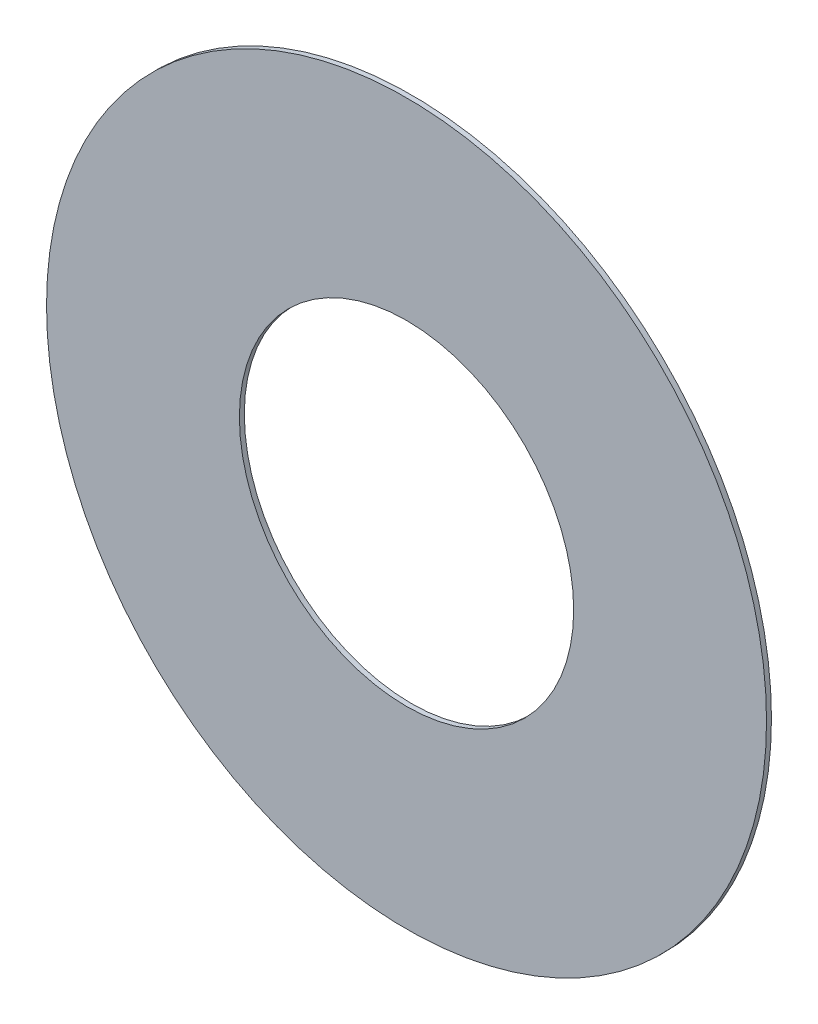
ISO-10303-21;
HEADER;
FILE_DESCRIPTION(('STEP AP214'),'2;1');
FILE_NAME('part.step','',(''),(''),'','','');
FILE_SCHEMA(('AUTOMOTIVE_DESIGN { 1 0 10303 214 1 1 1 1 }'));
ENDSEC;
DATA;
#1=APPLICATION_CONTEXT('core data for automotive mechanical design processes');
#2=APPLICATION_PROTOCOL_DEFINITION('international standard','automotive_design',2000,#1);
#3=PRODUCT_CONTEXT('',#1,'mechanical');
#4=PRODUCT('Part','Part','',(#3));
#5=PRODUCT_RELATED_PRODUCT_CATEGORY('part','',(#4));
#6=PRODUCT_DEFINITION_FORMATION('','',#4);
#7=PRODUCT_DEFINITION_CONTEXT('part definition',#1,'design');
#8=PRODUCT_DEFINITION('design','',#6,#7);
#9=PRODUCT_DEFINITION_SHAPE('','',#8);
#10=(LENGTH_UNIT() NAMED_UNIT(*) SI_UNIT(.MILLI.,.METRE.));
#11=(NAMED_UNIT(*) PLANE_ANGLE_UNIT() SI_UNIT($,.RADIAN.));
#12=(NAMED_UNIT(*) SI_UNIT($,.STERADIAN.) SOLID_ANGLE_UNIT());
#13=UNCERTAINTY_MEASURE_WITH_UNIT(LENGTH_MEASURE(1.E-05),#10,'distance_accuracy_value','');
#14=(GEOMETRIC_REPRESENTATION_CONTEXT(3) GLOBAL_UNCERTAINTY_ASSIGNED_CONTEXT((#13)) GLOBAL_UNIT_ASSIGNED_CONTEXT((#10,
#11,#12)) REPRESENTATION_CONTEXT('',''));
#15=CARTESIAN_POINT('',(0.,0.,0.));
#16=DIRECTION('',(0.,0.,1.));
#17=DIRECTION('',(1.,0.,0.));
#18=AXIS2_PLACEMENT_3D('',#15,#16,#17);
#19=CARTESIAN_POINT('',(0.,0.,0.0762));
#20=DIRECTION('',(0.,0.,-1.));
#21=DIRECTION('',(-1.,0.,0.));
#22=AXIS2_PLACEMENT_3D('',#19,#20,#21);
#23=CYLINDRICAL_SURFACE('',#22,5.55625);
#24=CARTESIAN_POINT('',(0.,0.,0.0762));
#25=DIRECTION('',(0.,0.,-1.));
#26=DIRECTION('',(1.,0.,0.));
#27=AXIS2_PLACEMENT_3D('',#24,#25,#26);
#28=CIRCLE('',#27,5.55625);
#29=CARTESIAN_POINT('',(5.55625,0.,0.0762));
#30=VERTEX_POINT('',#29);
#31=EDGE_CURVE('E10',#30,#30,#28,.T.);
#32=ORIENTED_EDGE('',*,*,#31,.T.);
#33=EDGE_LOOP('',(#32));
#34=FACE_BOUND('',#33,.T.);
#35=CARTESIAN_POINT('',(0.,0.,0.));
#36=DIRECTION('',(0.,0.,-1.));
#37=DIRECTION('',(1.,0.,0.));
#38=AXIS2_PLACEMENT_3D('',#35,#36,#37);
#39=CIRCLE('',#38,5.55625);
#40=CARTESIAN_POINT('',(5.55625,0.,0.));
#41=VERTEX_POINT('',#40);
#42=EDGE_CURVE('E33',#41,#41,#39,.T.);
#43=ORIENTED_EDGE('',*,*,#42,.F.);
#44=EDGE_LOOP('',(#43));
#45=FACE_BOUND('',#44,.T.);
#46=ADVANCED_FACE('F30',(#34,#45),#23,.T.);
#47=CARTESIAN_POINT('',(0.,0.,0.0762));
#48=DIRECTION('',(0.,0.,1.));
#49=DIRECTION('',(1.,0.,0.));
#50=AXIS2_PLACEMENT_3D('',#47,#48,#49);
#51=PLANE('',#50);
#52=CARTESIAN_POINT('',(0.,0.,0.0762));
#53=DIRECTION('',(0.,0.,-1.));
#54=DIRECTION('',(1.,0.,0.));
#55=AXIS2_PLACEMENT_3D('',#52,#53,#54);
#56=CIRCLE('',#55,2.5796875);
#57=CARTESIAN_POINT('',(2.5796875,0.,0.0762));
#58=VERTEX_POINT('',#57);
#59=EDGE_CURVE('E40',#58,#58,#56,.T.);
#60=ORIENTED_EDGE('',*,*,#59,.T.);
#61=EDGE_LOOP('',(#60));
#62=FACE_BOUND('',#61,.T.);
#63=ORIENTED_EDGE('',*,*,#31,.F.);
#64=EDGE_LOOP('',(#63));
#65=FACE_BOUND('',#64,.T.);
#66=ADVANCED_FACE('F48',(#62,#65),#51,.T.);
#67=CARTESIAN_POINT('',(0.,0.,0.));
#68=DIRECTION('',(0.,0.,1.));
#69=DIRECTION('',(1.,0.,0.));
#70=AXIS2_PLACEMENT_3D('',#67,#68,#69);
#71=PLANE('',#70);
#72=CARTESIAN_POINT('',(0.,0.,0.));
#73=DIRECTION('',(0.,0.,-1.));
#74=DIRECTION('',(1.,0.,0.));
#75=AXIS2_PLACEMENT_3D('',#72,#73,#74);
#76=CIRCLE('',#75,2.5796875);
#77=CARTESIAN_POINT('',(2.5796875,0.,0.));
#78=VERTEX_POINT('',#77);
#79=EDGE_CURVE('E42',#78,#78,#76,.T.);
#80=ORIENTED_EDGE('',*,*,#79,.F.);
#81=EDGE_LOOP('',(#80));
#82=FACE_BOUND('',#81,.T.);
#83=ORIENTED_EDGE('',*,*,#42,.T.);
#84=EDGE_LOOP('',(#83));
#85=FACE_BOUND('',#84,.T.);
#86=ADVANCED_FACE('F54',(#82,#85),#71,.F.);
#87=CARTESIAN_POINT('',(0.,0.,0.0762));
#88=DIRECTION('',(0.,0.,-1.));
#89=DIRECTION('',(-1.,0.,0.));
#90=AXIS2_PLACEMENT_3D('',#87,#88,#89);
#91=CYLINDRICAL_SURFACE('',#90,2.5796875);
#92=ORIENTED_EDGE('',*,*,#59,.F.);
#93=EDGE_LOOP('',(#92));
#94=FACE_BOUND('',#93,.T.);
#95=ORIENTED_EDGE('',*,*,#79,.T.);
#96=EDGE_LOOP('',(#95));
#97=FACE_BOUND('',#96,.T.);
#98=ADVANCED_FACE('F51',(#94,#97),#91,.F.);
#99=CLOSED_SHELL('',(#46,#66,#86,#98));
#100=MANIFOLD_SOLID_BREP('B2',#99);
#101=ADVANCED_BREP_SHAPE_REPRESENTATION('',(#18,#100),#14);
#102=SHAPE_DEFINITION_REPRESENTATION(#9,#101);
ENDSEC;
END-ISO-10303-21;
